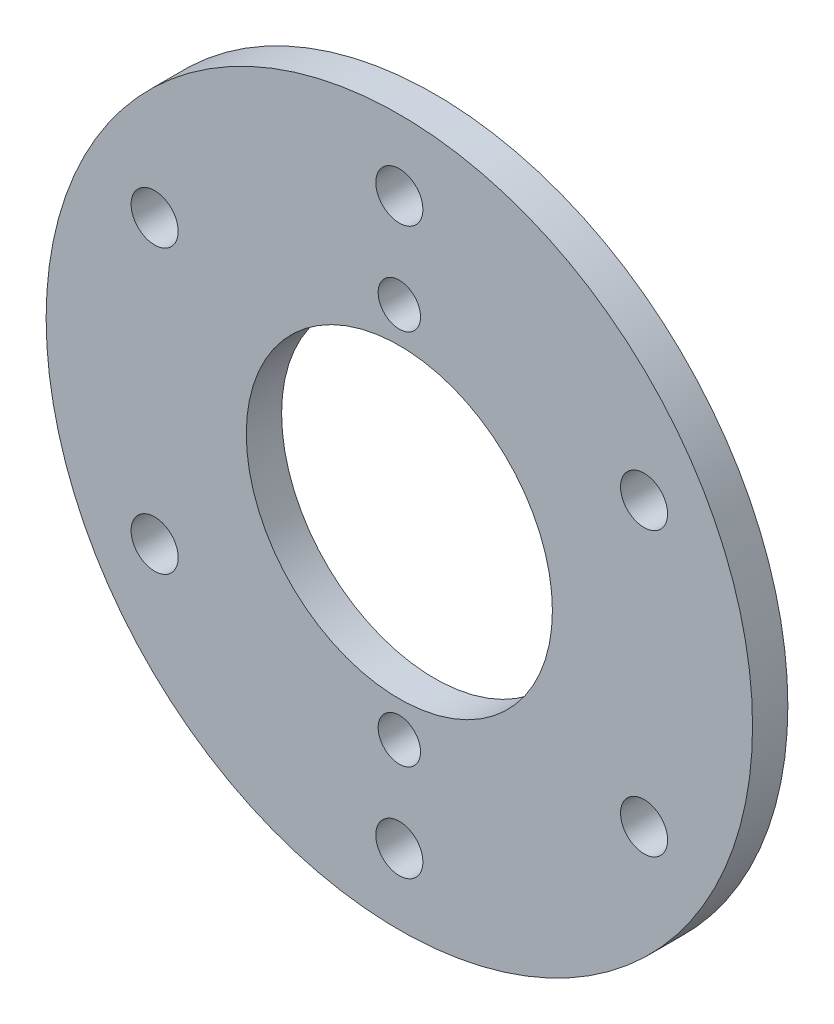
ISO-10303-21;
HEADER;
FILE_DESCRIPTION(('STEP AP214'),'2;1');
FILE_NAME('part.step','',(''),(''),'','','');
FILE_SCHEMA(('AUTOMOTIVE_DESIGN { 1 0 10303 214 1 1 1 1 }'));
ENDSEC;
DATA;
#1=APPLICATION_CONTEXT('core data for automotive mechanical design processes');
#2=APPLICATION_PROTOCOL_DEFINITION('international standard','automotive_design',2000,#1);
#3=PRODUCT_CONTEXT('',#1,'mechanical');
#4=PRODUCT('Part','Part','',(#3));
#5=PRODUCT_RELATED_PRODUCT_CATEGORY('part','',(#4));
#6=PRODUCT_DEFINITION_FORMATION('','',#4);
#7=PRODUCT_DEFINITION_CONTEXT('part definition',#1,'design');
#8=PRODUCT_DEFINITION('design','',#6,#7);
#9=PRODUCT_DEFINITION_SHAPE('','',#8);
#10=(LENGTH_UNIT() NAMED_UNIT(*) SI_UNIT(.MILLI.,.METRE.));
#11=(NAMED_UNIT(*) PLANE_ANGLE_UNIT() SI_UNIT($,.RADIAN.));
#12=(NAMED_UNIT(*) SI_UNIT($,.STERADIAN.) SOLID_ANGLE_UNIT());
#13=UNCERTAINTY_MEASURE_WITH_UNIT(LENGTH_MEASURE(1.E-05),#10,'distance_accuracy_value','');
#14=(GEOMETRIC_REPRESENTATION_CONTEXT(3) GLOBAL_UNCERTAINTY_ASSIGNED_CONTEXT((#13)) GLOBAL_UNIT_ASSIGNED_CONTEXT((#10,
#11,#12)) REPRESENTATION_CONTEXT('',''));
#15=CARTESIAN_POINT('',(0.,0.,0.));
#16=DIRECTION('',(0.,0.,1.));
#17=DIRECTION('',(1.,0.,0.));
#18=AXIS2_PLACEMENT_3D('',#15,#16,#17);
#19=CARTESIAN_POINT('',(0.,0.,7.5));
#20=DIRECTION('',(0.,0.,1.));
#21=DIRECTION('',(1.,0.,0.));
#22=AXIS2_PLACEMENT_3D('',#19,#20,#21);
#23=PLANE('',#22);
#24=CARTESIAN_POINT('',(-103.923048454132,60.0000000000012,7.5));
#25=DIRECTION('',(0.,0.,1.));
#26=DIRECTION('',(1.,0.,0.));
#27=AXIS2_PLACEMENT_3D('',#24,#25,#26);
#28=CIRCLE('',#27,10.);
#29=CARTESIAN_POINT('',(-93.9230484541319,60.0000000000012,7.5));
#30=VERTEX_POINT('',#29);
#31=EDGE_CURVE('E89',#30,#30,#28,.T.);
#32=ORIENTED_EDGE('',*,*,#31,.F.);
#33=EDGE_LOOP('',(#32));
#34=FACE_BOUND('',#33,.T.);
#35=CARTESIAN_POINT('',(-8.37955521322352E-13,-120.,7.5));
#36=DIRECTION('',(0.,0.,1.));
#37=DIRECTION('',(1.,0.,0.));
#38=AXIS2_PLACEMENT_3D('',#35,#36,#37);
#39=CIRCLE('',#38,10.);
#40=CARTESIAN_POINT('',(9.99999999999917,-120.,7.5));
#41=VERTEX_POINT('',#40);
#42=EDGE_CURVE('E77',#41,#41,#39,.T.);
#43=ORIENTED_EDGE('',*,*,#42,.F.);
#44=EDGE_LOOP('',(#43));
#45=FACE_BOUND('',#44,.T.);
#46=CARTESIAN_POINT('',(103.923048454133,59.9999999999998,7.5));
#47=DIRECTION('',(0.,0.,1.));
#48=DIRECTION('',(1.,0.,0.));
#49=AXIS2_PLACEMENT_3D('',#46,#47,#48);
#50=CIRCLE('',#49,10.);
#51=CARTESIAN_POINT('',(113.923048454133,59.9999999999998,7.5));
#52=VERTEX_POINT('',#51);
#53=EDGE_CURVE('E65',#52,#52,#50,.T.);
#54=ORIENTED_EDGE('',*,*,#53,.F.);
#55=EDGE_LOOP('',(#54));
#56=FACE_BOUND('',#55,.T.);
#57=CARTESIAN_POINT('',(0.,80.,7.5));
#58=DIRECTION('',(0.,0.,1.));
#59=DIRECTION('',(1.,0.,0.));
#60=AXIS2_PLACEMENT_3D('',#57,#58,#59);
#61=CIRCLE('',#60,9.);
#62=CARTESIAN_POINT('',(9.,80.,7.5));
#63=VERTEX_POINT('',#62);
#64=EDGE_CURVE('E53',#63,#63,#61,.T.);
#65=ORIENTED_EDGE('',*,*,#64,.F.);
#66=EDGE_LOOP('',(#65));
#67=FACE_BOUND('',#66,.T.);
#68=CARTESIAN_POINT('',(0.,0.,7.5));
#69=DIRECTION('',(0.,0.,1.));
#70=DIRECTION('',(1.,0.,0.));
#71=AXIS2_PLACEMENT_3D('',#68,#69,#70);
#72=CIRCLE('',#71,150.);
#73=CARTESIAN_POINT('',(150.,0.,7.5));
#74=VERTEX_POINT('',#73);
#75=EDGE_CURVE('E10',#74,#74,#72,.T.);
#76=ORIENTED_EDGE('',*,*,#75,.T.);
#77=EDGE_LOOP('',(#76));
#78=FACE_BOUND('',#77,.T.);
#79=CARTESIAN_POINT('',(0.,0.,7.5));
#80=DIRECTION('',(0.,0.,1.));
#81=DIRECTION('',(1.,0.,0.));
#82=AXIS2_PLACEMENT_3D('',#79,#80,#81);
#83=CIRCLE('',#82,65.);
#84=CARTESIAN_POINT('',(65.,0.,7.5));
#85=VERTEX_POINT('',#84);
#86=EDGE_CURVE('E48',#85,#85,#83,.T.);
#87=ORIENTED_EDGE('',*,*,#86,.F.);
#88=EDGE_LOOP('',(#87));
#89=FACE_BOUND('',#88,.T.);
#90=CARTESIAN_POINT('',(0.,120.,7.5));
#91=DIRECTION('',(0.,0.,1.));
#92=DIRECTION('',(1.,0.,0.));
#93=AXIS2_PLACEMENT_3D('',#90,#91,#92);
#94=CIRCLE('',#93,10.);
#95=CARTESIAN_POINT('',(10.,120.,7.5));
#96=VERTEX_POINT('',#95);
#97=EDGE_CURVE('E59',#96,#96,#94,.T.);
#98=ORIENTED_EDGE('',*,*,#97,.F.);
#99=EDGE_LOOP('',(#98));
#100=FACE_BOUND('',#99,.T.);
#101=CARTESIAN_POINT('',(103.923048454132,-60.0000000000005,7.5));
#102=DIRECTION('',(0.,0.,1.));
#103=DIRECTION('',(1.,0.,0.));
#104=AXIS2_PLACEMENT_3D('',#101,#102,#103);
#105=CIRCLE('',#104,10.);
#106=CARTESIAN_POINT('',(113.923048454132,-60.0000000000005,7.5));
#107=VERTEX_POINT('',#106);
#108=EDGE_CURVE('E71',#107,#107,#105,.T.);
#109=ORIENTED_EDGE('',*,*,#108,.F.);
#110=EDGE_LOOP('',(#109));
#111=FACE_BOUND('',#110,.T.);
#112=CARTESIAN_POINT('',(-103.923048454133,-59.999999999999,7.5));
#113=DIRECTION('',(0.,0.,1.));
#114=DIRECTION('',(1.,0.,0.));
#115=AXIS2_PLACEMENT_3D('',#112,#113,#114);
#116=CIRCLE('',#115,10.);
#117=CARTESIAN_POINT('',(-93.9230484541332,-59.999999999999,7.5));
#118=VERTEX_POINT('',#117);
#119=EDGE_CURVE('E83',#118,#118,#116,.T.);
#120=ORIENTED_EDGE('',*,*,#119,.F.);
#121=EDGE_LOOP('',(#120));
#122=FACE_BOUND('',#121,.T.);
#123=CARTESIAN_POINT('',(0.,-80.,7.5));
#124=DIRECTION('',(0.,0.,1.));
#125=DIRECTION('',(1.,0.,0.));
#126=AXIS2_PLACEMENT_3D('',#123,#124,#125);
#127=CIRCLE('',#126,9.00000000000001);
#128=CARTESIAN_POINT('',(9.00000000000001,-80.,7.5));
#129=VERTEX_POINT('',#128);
#130=EDGE_CURVE('E95',#129,#129,#127,.T.);
#131=ORIENTED_EDGE('',*,*,#130,.F.);
#132=EDGE_LOOP('',(#131));
#133=FACE_BOUND('',#132,.T.);
#134=ADVANCED_FACE('F37',(#34,#45,#56,#67,#78,#89,#100,#111,#122,#133),#23,.T.);
#135=CARTESIAN_POINT('',(0.,0.,-7.5));
#136=DIRECTION('',(0.,0.,1.));
#137=DIRECTION('',(1.,0.,0.));
#138=AXIS2_PLACEMENT_3D('',#135,#136,#137);
#139=PLANE('',#138);
#140=CARTESIAN_POINT('',(0.,0.,-7.5));
#141=DIRECTION('',(0.,0.,1.));
#142=DIRECTION('',(1.,0.,0.));
#143=AXIS2_PLACEMENT_3D('',#140,#141,#142);
#144=CIRCLE('',#143,150.);
#145=CARTESIAN_POINT('',(150.,0.,-7.5));
#146=VERTEX_POINT('',#145);
#147=EDGE_CURVE('E41',#146,#146,#144,.T.);
#148=ORIENTED_EDGE('',*,*,#147,.F.);
#149=EDGE_LOOP('',(#148));
#150=FACE_BOUND('',#149,.T.);
#151=CARTESIAN_POINT('',(0.,0.,-7.5));
#152=DIRECTION('',(0.,0.,1.));
#153=DIRECTION('',(1.,0.,0.));
#154=AXIS2_PLACEMENT_3D('',#151,#152,#153);
#155=CIRCLE('',#154,65.);
#156=CARTESIAN_POINT('',(65.,0.,-7.5));
#157=VERTEX_POINT('',#156);
#158=EDGE_CURVE('E50',#157,#157,#155,.T.);
#159=ORIENTED_EDGE('',*,*,#158,.T.);
#160=EDGE_LOOP('',(#159));
#161=FACE_BOUND('',#160,.T.);
#162=CARTESIAN_POINT('',(0.,80.,-7.5));
#163=DIRECTION('',(0.,0.,1.));
#164=DIRECTION('',(1.,0.,0.));
#165=AXIS2_PLACEMENT_3D('',#162,#163,#164);
#166=CIRCLE('',#165,9.);
#167=CARTESIAN_POINT('',(9.,80.,-7.5));
#168=VERTEX_POINT('',#167);
#169=EDGE_CURVE('E56',#168,#168,#166,.T.);
#170=ORIENTED_EDGE('',*,*,#169,.T.);
#171=EDGE_LOOP('',(#170));
#172=FACE_BOUND('',#171,.T.);
#173=CARTESIAN_POINT('',(0.,120.,-7.5));
#174=DIRECTION('',(0.,0.,1.));
#175=DIRECTION('',(1.,0.,0.));
#176=AXIS2_PLACEMENT_3D('',#173,#174,#175);
#177=CIRCLE('',#176,10.);
#178=CARTESIAN_POINT('',(10.,120.,-7.5));
#179=VERTEX_POINT('',#178);
#180=EDGE_CURVE('E62',#179,#179,#177,.T.);
#181=ORIENTED_EDGE('',*,*,#180,.T.);
#182=EDGE_LOOP('',(#181));
#183=FACE_BOUND('',#182,.T.);
#184=CARTESIAN_POINT('',(103.923048454133,59.9999999999998,-7.5));
#185=DIRECTION('',(0.,0.,1.));
#186=DIRECTION('',(1.,0.,0.));
#187=AXIS2_PLACEMENT_3D('',#184,#185,#186);
#188=CIRCLE('',#187,10.);
#189=CARTESIAN_POINT('',(113.923048454133,59.9999999999998,-7.5));
#190=VERTEX_POINT('',#189);
#191=EDGE_CURVE('E68',#190,#190,#188,.T.);
#192=ORIENTED_EDGE('',*,*,#191,.T.);
#193=EDGE_LOOP('',(#192));
#194=FACE_BOUND('',#193,.T.);
#195=CARTESIAN_POINT('',(103.923048454132,-60.0000000000005,-7.5));
#196=DIRECTION('',(0.,0.,1.));
#197=DIRECTION('',(1.,0.,0.));
#198=AXIS2_PLACEMENT_3D('',#195,#196,#197);
#199=CIRCLE('',#198,10.);
#200=CARTESIAN_POINT('',(113.923048454132,-60.0000000000005,-7.5));
#201=VERTEX_POINT('',#200);
#202=EDGE_CURVE('E74',#201,#201,#199,.T.);
#203=ORIENTED_EDGE('',*,*,#202,.T.);
#204=EDGE_LOOP('',(#203));
#205=FACE_BOUND('',#204,.T.);
#206=CARTESIAN_POINT('',(-8.37955521322352E-13,-120.,-7.5));
#207=DIRECTION('',(0.,0.,1.));
#208=DIRECTION('',(1.,0.,0.));
#209=AXIS2_PLACEMENT_3D('',#206,#207,#208);
#210=CIRCLE('',#209,10.);
#211=CARTESIAN_POINT('',(9.99999999999917,-120.,-7.5));
#212=VERTEX_POINT('',#211);
#213=EDGE_CURVE('E80',#212,#212,#210,.T.);
#214=ORIENTED_EDGE('',*,*,#213,.T.);
#215=EDGE_LOOP('',(#214));
#216=FACE_BOUND('',#215,.T.);
#217=CARTESIAN_POINT('',(-103.923048454133,-59.999999999999,-7.5));
#218=DIRECTION('',(0.,0.,1.));
#219=DIRECTION('',(1.,0.,0.));
#220=AXIS2_PLACEMENT_3D('',#217,#218,#219);
#221=CIRCLE('',#220,10.);
#222=CARTESIAN_POINT('',(-93.9230484541332,-59.999999999999,-7.5));
#223=VERTEX_POINT('',#222);
#224=EDGE_CURVE('E86',#223,#223,#221,.T.);
#225=ORIENTED_EDGE('',*,*,#224,.T.);
#226=EDGE_LOOP('',(#225));
#227=FACE_BOUND('',#226,.T.);
#228=CARTESIAN_POINT('',(-103.923048454132,60.0000000000012,-7.5));
#229=DIRECTION('',(0.,0.,1.));
#230=DIRECTION('',(1.,0.,0.));
#231=AXIS2_PLACEMENT_3D('',#228,#229,#230);
#232=CIRCLE('',#231,10.);
#233=CARTESIAN_POINT('',(-93.9230484541319,60.0000000000012,-7.5));
#234=VERTEX_POINT('',#233);
#235=EDGE_CURVE('E92',#234,#234,#232,.T.);
#236=ORIENTED_EDGE('',*,*,#235,.T.);
#237=EDGE_LOOP('',(#236));
#238=FACE_BOUND('',#237,.T.);
#239=CARTESIAN_POINT('',(0.,-80.,-7.5));
#240=DIRECTION('',(0.,0.,1.));
#241=DIRECTION('',(1.,0.,0.));
#242=AXIS2_PLACEMENT_3D('',#239,#240,#241);
#243=CIRCLE('',#242,9.00000000000001);
#244=CARTESIAN_POINT('',(9.00000000000001,-80.,-7.5));
#245=VERTEX_POINT('',#244);
#246=EDGE_CURVE('E98',#245,#245,#243,.T.);
#247=ORIENTED_EDGE('',*,*,#246,.T.);
#248=EDGE_LOOP('',(#247));
#249=FACE_BOUND('',#248,.T.);
#250=ADVANCED_FACE('F108',(#150,#161,#172,#183,#194,#205,#216,#227,#238,#249),#139,.F.);
#251=CARTESIAN_POINT('',(0.,0.,7.5));
#252=DIRECTION('',(0.,0.,-1.));
#253=DIRECTION('',(-1.,0.,0.));
#254=AXIS2_PLACEMENT_3D('',#251,#252,#253);
#255=CYLINDRICAL_SURFACE('',#254,150.);
#256=ORIENTED_EDGE('',*,*,#75,.F.);
#257=EDGE_LOOP('',(#256));
#258=FACE_BOUND('',#257,.T.);
#259=ORIENTED_EDGE('',*,*,#147,.T.);
#260=EDGE_LOOP('',(#259));
#261=FACE_BOUND('',#260,.T.);
#262=ADVANCED_FACE('F39',(#258,#261),#255,.T.);
#263=CARTESIAN_POINT('',(0.,0.,7.5));
#264=DIRECTION('',(0.,0.,-1.));
#265=DIRECTION('',(-1.,0.,0.));
#266=AXIS2_PLACEMENT_3D('',#263,#264,#265);
#267=CYLINDRICAL_SURFACE('',#266,65.);
#268=ORIENTED_EDGE('',*,*,#86,.T.);
#269=EDGE_LOOP('',(#268));
#270=FACE_BOUND('',#269,.T.);
#271=ORIENTED_EDGE('',*,*,#158,.F.);
#272=EDGE_LOOP('',(#271));
#273=FACE_BOUND('',#272,.T.);
#274=ADVANCED_FACE('F118',(#270,#273),#267,.F.);
#275=CARTESIAN_POINT('',(0.,80.,7.5));
#276=DIRECTION('',(0.,0.,-1.));
#277=DIRECTION('',(-1.,0.,0.));
#278=AXIS2_PLACEMENT_3D('',#275,#276,#277);
#279=CYLINDRICAL_SURFACE('',#278,9.);
#280=ORIENTED_EDGE('',*,*,#64,.T.);
#281=EDGE_LOOP('',(#280));
#282=FACE_BOUND('',#281,.T.);
#283=ORIENTED_EDGE('',*,*,#169,.F.);
#284=EDGE_LOOP('',(#283));
#285=FACE_BOUND('',#284,.T.);
#286=ADVANCED_FACE('F121',(#282,#285),#279,.F.);
#287=CARTESIAN_POINT('',(0.,120.,7.5));
#288=DIRECTION('',(0.,0.,-1.));
#289=DIRECTION('',(-1.,0.,0.));
#290=AXIS2_PLACEMENT_3D('',#287,#288,#289);
#291=CYLINDRICAL_SURFACE('',#290,10.);
#292=ORIENTED_EDGE('',*,*,#97,.T.);
#293=EDGE_LOOP('',(#292));
#294=FACE_BOUND('',#293,.T.);
#295=ORIENTED_EDGE('',*,*,#180,.F.);
#296=EDGE_LOOP('',(#295));
#297=FACE_BOUND('',#296,.T.);
#298=ADVANCED_FACE('F125',(#294,#297),#291,.F.);
#299=CARTESIAN_POINT('',(103.923048454133,59.9999999999998,7.5));
#300=DIRECTION('',(0.,0.,-1.));
#301=DIRECTION('',(-1.,0.,0.));
#302=AXIS2_PLACEMENT_3D('',#299,#300,#301);
#303=CYLINDRICAL_SURFACE('',#302,10.);
#304=ORIENTED_EDGE('',*,*,#53,.T.);
#305=EDGE_LOOP('',(#304));
#306=FACE_BOUND('',#305,.T.);
#307=ORIENTED_EDGE('',*,*,#191,.F.);
#308=EDGE_LOOP('',(#307));
#309=FACE_BOUND('',#308,.T.);
#310=ADVANCED_FACE('F129',(#306,#309),#303,.F.);
#311=CARTESIAN_POINT('',(103.923048454132,-60.0000000000005,7.5));
#312=DIRECTION('',(0.,0.,-1.));
#313=DIRECTION('',(-1.,0.,0.));
#314=AXIS2_PLACEMENT_3D('',#311,#312,#313);
#315=CYLINDRICAL_SURFACE('',#314,10.);
#316=ORIENTED_EDGE('',*,*,#108,.T.);
#317=EDGE_LOOP('',(#316));
#318=FACE_BOUND('',#317,.T.);
#319=ORIENTED_EDGE('',*,*,#202,.F.);
#320=EDGE_LOOP('',(#319));
#321=FACE_BOUND('',#320,.T.);
#322=ADVANCED_FACE('F133',(#318,#321),#315,.F.);
#323=CARTESIAN_POINT('',(-8.37955521322352E-13,-120.,7.5));
#324=DIRECTION('',(0.,0.,-1.));
#325=DIRECTION('',(-1.,0.,0.));
#326=AXIS2_PLACEMENT_3D('',#323,#324,#325);
#327=CYLINDRICAL_SURFACE('',#326,10.);
#328=ORIENTED_EDGE('',*,*,#42,.T.);
#329=EDGE_LOOP('',(#328));
#330=FACE_BOUND('',#329,.T.);
#331=ORIENTED_EDGE('',*,*,#213,.F.);
#332=EDGE_LOOP('',(#331));
#333=FACE_BOUND('',#332,.T.);
#334=ADVANCED_FACE('F137',(#330,#333),#327,.F.);
#335=CARTESIAN_POINT('',(-103.923048454133,-59.999999999999,7.5));
#336=DIRECTION('',(0.,0.,-1.));
#337=DIRECTION('',(-1.,0.,0.));
#338=AXIS2_PLACEMENT_3D('',#335,#336,#337);
#339=CYLINDRICAL_SURFACE('',#338,10.);
#340=ORIENTED_EDGE('',*,*,#119,.T.);
#341=EDGE_LOOP('',(#340));
#342=FACE_BOUND('',#341,.T.);
#343=ORIENTED_EDGE('',*,*,#224,.F.);
#344=EDGE_LOOP('',(#343));
#345=FACE_BOUND('',#344,.T.);
#346=ADVANCED_FACE('F141',(#342,#345),#339,.F.);
#347=CARTESIAN_POINT('',(-103.923048454132,60.0000000000012,7.5));
#348=DIRECTION('',(0.,0.,-1.));
#349=DIRECTION('',(-1.,0.,0.));
#350=AXIS2_PLACEMENT_3D('',#347,#348,#349);
#351=CYLINDRICAL_SURFACE('',#350,10.);
#352=ORIENTED_EDGE('',*,*,#31,.T.);
#353=EDGE_LOOP('',(#352));
#354=FACE_BOUND('',#353,.T.);
#355=ORIENTED_EDGE('',*,*,#235,.F.);
#356=EDGE_LOOP('',(#355));
#357=FACE_BOUND('',#356,.T.);
#358=ADVANCED_FACE('F145',(#354,#357),#351,.F.);
#359=CARTESIAN_POINT('',(0.,-80.,7.5));
#360=DIRECTION('',(0.,0.,-1.));
#361=DIRECTION('',(-1.,0.,0.));
#362=AXIS2_PLACEMENT_3D('',#359,#360,#361);
#363=CYLINDRICAL_SURFACE('',#362,9.00000000000001);
#364=ORIENTED_EDGE('',*,*,#130,.T.);
#365=EDGE_LOOP('',(#364));
#366=FACE_BOUND('',#365,.T.);
#367=ORIENTED_EDGE('',*,*,#246,.F.);
#368=EDGE_LOOP('',(#367));
#369=FACE_BOUND('',#368,.T.);
#370=ADVANCED_FACE('F104',(#366,#369),#363,.F.);
#371=CLOSED_SHELL('',(#134,#250,#262,#274,#286,#298,#310,#322,#334,#346,#358,#370));
#372=MANIFOLD_SOLID_BREP('B2',#371);
#373=ADVANCED_BREP_SHAPE_REPRESENTATION('',(#18,#372),#14);
#374=SHAPE_DEFINITION_REPRESENTATION(#9,#373);
ENDSEC;
END-ISO-10303-21;
